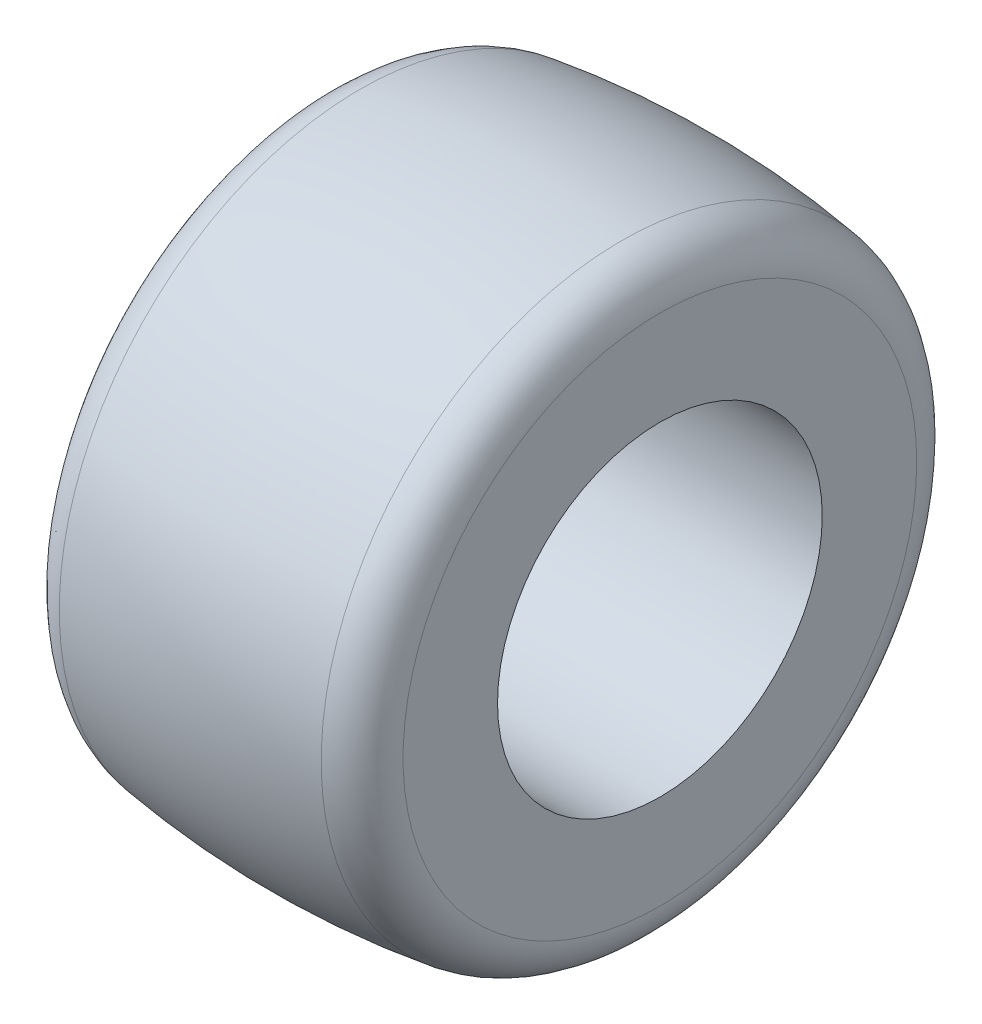
ISO-10303-21;
HEADER;
FILE_DESCRIPTION(('STEP AP214'),'2;1');
FILE_NAME('part.step','',(''),(''),'','','');
FILE_SCHEMA(('AUTOMOTIVE_DESIGN { 1 0 10303 214 1 1 1 1 }'));
ENDSEC;
DATA;
#1=APPLICATION_CONTEXT('core data for automotive mechanical design processes');
#2=APPLICATION_PROTOCOL_DEFINITION('international standard','automotive_design',2000,#1);
#3=PRODUCT_CONTEXT('',#1,'mechanical');
#4=PRODUCT('Part','Part','',(#3));
#5=PRODUCT_RELATED_PRODUCT_CATEGORY('part','',(#4));
#6=PRODUCT_DEFINITION_FORMATION('','',#4);
#7=PRODUCT_DEFINITION_CONTEXT('part definition',#1,'design');
#8=PRODUCT_DEFINITION('design','',#6,#7);
#9=PRODUCT_DEFINITION_SHAPE('','',#8);
#10=(LENGTH_UNIT() NAMED_UNIT(*) SI_UNIT(.MILLI.,.METRE.));
#11=(NAMED_UNIT(*) PLANE_ANGLE_UNIT() SI_UNIT($,.RADIAN.));
#12=(NAMED_UNIT(*) SI_UNIT($,.STERADIAN.) SOLID_ANGLE_UNIT());
#13=UNCERTAINTY_MEASURE_WITH_UNIT(LENGTH_MEASURE(1.E-05),#10,'distance_accuracy_value','');
#14=(GEOMETRIC_REPRESENTATION_CONTEXT(3) GLOBAL_UNCERTAINTY_ASSIGNED_CONTEXT((#13)) GLOBAL_UNIT_ASSIGNED_CONTEXT((#10,
#11,#12)) REPRESENTATION_CONTEXT('',''));
#15=CARTESIAN_POINT('',(0.,0.,0.));
#16=DIRECTION('',(0.,0.,1.));
#17=DIRECTION('',(1.,0.,0.));
#18=AXIS2_PLACEMENT_3D('',#15,#16,#17);
#19=CARTESIAN_POINT('',(0.,0.,0.));
#20=DIRECTION('',(-1.,0.,0.));
#21=DIRECTION('',(0.,0.,1.));
#22=AXIS2_PLACEMENT_3D('',#19,#20,#21);
#23=PLANE('',#22);
#24=CARTESIAN_POINT('',(0.,0.,0.));
#25=DIRECTION('',(1.,0.,0.));
#26=DIRECTION('',(0.,0.,-1.));
#27=AXIS2_PLACEMENT_3D('',#24,#25,#26);
#28=CIRCLE('',#27,11.);
#29=CARTESIAN_POINT('',(0.,0.,-11.));
#30=VERTEX_POINT('',#29);
#31=EDGE_CURVE('E56',#30,#30,#28,.T.);
#32=ORIENTED_EDGE('',*,*,#31,.T.);
#33=EDGE_LOOP('',(#32));
#34=FACE_BOUND('',#33,.T.);
#35=CARTESIAN_POINT('',(0.,0.,0.));
#36=DIRECTION('',(1.,0.,0.));
#37=DIRECTION('',(0.,0.,-1.));
#38=AXIS2_PLACEMENT_3D('',#35,#36,#37);
#39=CIRCLE('',#38,17.4015433631428);
#40=CARTESIAN_POINT('',(0.,0.,-17.4015433631428));
#41=VERTEX_POINT('',#40);
#42=EDGE_CURVE('E10',#41,#41,#39,.T.);
#43=ORIENTED_EDGE('',*,*,#42,.F.);
#44=EDGE_LOOP('',(#43));
#45=FACE_BOUND('',#44,.T.);
#46=ADVANCED_FACE('F37',(#34,#45),#23,.T.);
#47=CARTESIAN_POINT('',(3.,0.,0.));
#48=DIRECTION('',(1.,0.,0.));
#49=DIRECTION('',(0.,0.,-1.));
#50=AXIS2_PLACEMENT_3D('',#47,#48,#49);
#51=TOROIDAL_SURFACE('',#50,17.4015433631428,3.);
#52=ORIENTED_EDGE('',*,*,#42,.T.);
#53=EDGE_LOOP('',(#52));
#54=FACE_BOUND('',#53,.T.);
#55=CARTESIAN_POINT('',(2.57718120805368,0.,0.));
#56=DIRECTION('',(1.,0.,0.));
#57=DIRECTION('',(0.,0.,-1.));
#58=AXIS2_PLACEMENT_3D('',#55,#56,#57);
#59=CIRCLE('',#58,20.3715979534116);
#60=CARTESIAN_POINT('',(2.57718120805368,0.,-20.3715979534116));
#61=VERTEX_POINT('',#60);
#62=EDGE_CURVE('E43',#61,#61,#59,.T.);
#63=ORIENTED_EDGE('',*,*,#62,.F.);
#64=EDGE_LOOP('',(#63));
#65=FACE_BOUND('',#64,.T.);
#66=ADVANCED_FACE('F85',(#54,#65),#51,.T.);
#67=CARTESIAN_POINT('',(11.45,0.,0.));
#68=DIRECTION('',(1.,0.,0.));
#69=DIRECTION('',(0.,0.,-1.));
#70=AXIS2_PLACEMENT_3D('',#67,#68,#69);
#71=DEGENERATE_TOROIDAL_SURFACE('',#70,41.9547619047607,62.9547619047607,.F.);
#72=ORIENTED_EDGE('',*,*,#62,.T.);
#73=EDGE_LOOP('',(#72));
#74=FACE_BOUND('',#73,.T.);
#75=CARTESIAN_POINT('',(20.3228187919463,0.,0.));
#76=DIRECTION('',(1.,0.,0.));
#77=DIRECTION('',(0.,0.,-1.));
#78=AXIS2_PLACEMENT_3D('',#75,#76,#77);
#79=CIRCLE('',#78,20.3715979534116);
#80=CARTESIAN_POINT('',(20.3228187919463,0.,-20.3715979534116));
#81=VERTEX_POINT('',#80);
#82=EDGE_CURVE('E47',#81,#81,#79,.T.);
#83=ORIENTED_EDGE('',*,*,#82,.F.);
#84=EDGE_LOOP('',(#83));
#85=FACE_BOUND('',#84,.T.);
#86=ADVANCED_FACE('F79',(#74,#85),#71,.F.);
#87=CARTESIAN_POINT('',(19.9,0.,0.));
#88=DIRECTION('',(1.,0.,0.));
#89=DIRECTION('',(0.,0.,-1.));
#90=AXIS2_PLACEMENT_3D('',#87,#88,#89);
#91=TOROIDAL_SURFACE('',#90,17.4015433631428,3.);
#92=ORIENTED_EDGE('',*,*,#82,.T.);
#93=EDGE_LOOP('',(#92));
#94=FACE_BOUND('',#93,.T.);
#95=CARTESIAN_POINT('',(22.9,0.,0.));
#96=DIRECTION('',(1.,0.,0.));
#97=DIRECTION('',(0.,0.,-1.));
#98=AXIS2_PLACEMENT_3D('',#95,#96,#97);
#99=CIRCLE('',#98,17.4015433631428);
#100=CARTESIAN_POINT('',(22.9,0.,-17.4015433631428));
#101=VERTEX_POINT('',#100);
#102=EDGE_CURVE('E51',#101,#101,#99,.T.);
#103=ORIENTED_EDGE('',*,*,#102,.F.);
#104=EDGE_LOOP('',(#103));
#105=FACE_BOUND('',#104,.T.);
#106=ADVANCED_FACE('F74',(#94,#105),#91,.T.);
#107=CARTESIAN_POINT('',(22.9,17.4015433631428,0.));
#108=DIRECTION('',(1.,0.,0.));
#109=DIRECTION('',(0.,0.,-1.));
#110=AXIS2_PLACEMENT_3D('',#107,#108,#109);
#111=PLANE('',#110);
#112=CARTESIAN_POINT('',(22.9,0.,0.));
#113=DIRECTION('',(1.,0.,0.));
#114=DIRECTION('',(0.,0.,-1.));
#115=AXIS2_PLACEMENT_3D('',#112,#113,#114);
#116=CIRCLE('',#115,11.);
#117=CARTESIAN_POINT('',(22.9,0.,-11.));
#118=VERTEX_POINT('',#117);
#119=EDGE_CURVE('E57',#118,#118,#116,.T.);
#120=ORIENTED_EDGE('',*,*,#119,.F.);
#121=EDGE_LOOP('',(#120));
#122=FACE_BOUND('',#121,.T.);
#123=ORIENTED_EDGE('',*,*,#102,.T.);
#124=EDGE_LOOP('',(#123));
#125=FACE_BOUND('',#124,.T.);
#126=ADVANCED_FACE('F68',(#122,#125),#111,.T.);
#127=CARTESIAN_POINT('',(0.,0.,0.));
#128=DIRECTION('',(1.,0.,0.));
#129=DIRECTION('',(0.,0.,-1.));
#130=AXIS2_PLACEMENT_3D('',#127,#128,#129);
#131=CYLINDRICAL_SURFACE('',#130,11.);
#132=ORIENTED_EDGE('',*,*,#31,.F.);
#133=EDGE_LOOP('',(#132));
#134=FACE_BOUND('',#133,.T.);
#135=ORIENTED_EDGE('',*,*,#119,.T.);
#136=EDGE_LOOP('',(#135));
#137=FACE_BOUND('',#136,.T.);
#138=ADVANCED_FACE('F65',(#134,#137),#131,.F.);
#139=CLOSED_SHELL('',(#46,#66,#86,#106,#126,#138));
#140=MANIFOLD_SOLID_BREP('B2',#139);
#141=ADVANCED_BREP_SHAPE_REPRESENTATION('',(#18,#140),#14);
#142=SHAPE_DEFINITION_REPRESENTATION(#9,#141);
ENDSEC;
END-ISO-10303-21;
